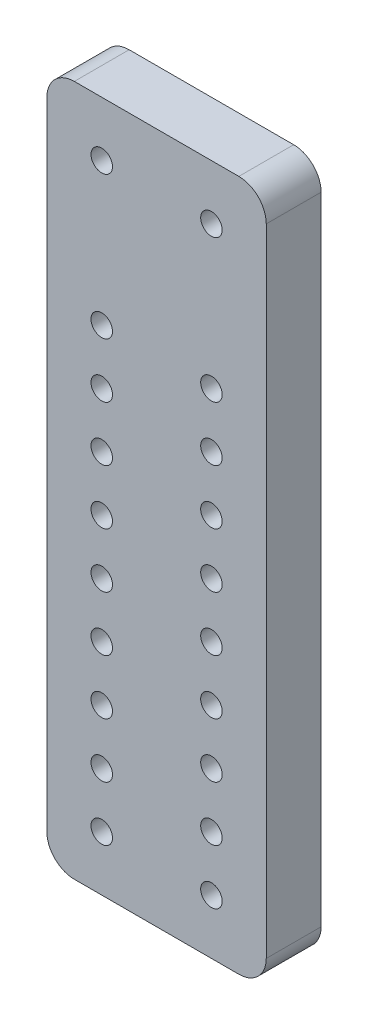
ISO-10303-21;
HEADER;
FILE_DESCRIPTION(('STEP AP214'),'2;1');
FILE_NAME('part.step','',(''),(''),'','','');
FILE_SCHEMA(('AUTOMOTIVE_DESIGN { 1 0 10303 214 1 1 1 1 }'));
ENDSEC;
DATA;
#1=APPLICATION_CONTEXT('core data for automotive mechanical design processes');
#2=APPLICATION_PROTOCOL_DEFINITION('international standard','automotive_design',2000,#1);
#3=PRODUCT_CONTEXT('',#1,'mechanical');
#4=PRODUCT('Part','Part','',(#3));
#5=PRODUCT_RELATED_PRODUCT_CATEGORY('part','',(#4));
#6=PRODUCT_DEFINITION_FORMATION('','',#4);
#7=PRODUCT_DEFINITION_CONTEXT('part definition',#1,'design');
#8=PRODUCT_DEFINITION('design','',#6,#7);
#9=PRODUCT_DEFINITION_SHAPE('','',#8);
#10=(LENGTH_UNIT() NAMED_UNIT(*) SI_UNIT(.MILLI.,.METRE.));
#11=(NAMED_UNIT(*) PLANE_ANGLE_UNIT() SI_UNIT($,.RADIAN.));
#12=(NAMED_UNIT(*) SI_UNIT($,.STERADIAN.) SOLID_ANGLE_UNIT());
#13=UNCERTAINTY_MEASURE_WITH_UNIT(LENGTH_MEASURE(1.E-05),#10,'distance_accuracy_value','');
#14=(GEOMETRIC_REPRESENTATION_CONTEXT(3) GLOBAL_UNCERTAINTY_ASSIGNED_CONTEXT((#13)) GLOBAL_UNIT_ASSIGNED_CONTEXT((#10,
#11,#12)) REPRESENTATION_CONTEXT('',''));
#15=CARTESIAN_POINT('',(0.,0.,0.));
#16=DIRECTION('',(0.,0.,1.));
#17=DIRECTION('',(1.,0.,0.));
#18=AXIS2_PLACEMENT_3D('',#15,#16,#17);
#19=CARTESIAN_POINT('',(0.,0.,-12.7));
#20=DIRECTION('',(-1.,0.,0.));
#21=DIRECTION('',(0.,0.,1.));
#22=AXIS2_PLACEMENT_3D('',#19,#20,#21);
#23=PLANE('',#22);
#24=DIRECTION('',(0.,-1.,0.));
#25=VECTOR('',#24,1.);
#26=CARTESIAN_POINT('',(0.,0.,-12.7));
#27=LINE('',#26,#25);
#28=CARTESIAN_POINT('',(0.,153.67,-12.7));
#29=VERTEX_POINT('',#28);
#30=CARTESIAN_POINT('',(0.,6.35,-12.7));
#31=VERTEX_POINT('',#30);
#32=EDGE_CURVE('E173',#29,#31,#27,.T.);
#33=ORIENTED_EDGE('',*,*,#32,.T.);
#34=DIRECTION('',(0.,0.,1.));
#35=VECTOR('',#34,1.);
#36=CARTESIAN_POINT('',(0.,6.35,-12.7));
#37=LINE('',#36,#35);
#38=CARTESIAN_POINT('',(0.,6.35,0.));
#39=VERTEX_POINT('',#38);
#40=EDGE_CURVE('E120',#31,#39,#37,.T.);
#41=ORIENTED_EDGE('',*,*,#40,.T.);
#42=DIRECTION('',(0.,-1.,0.));
#43=VECTOR('',#42,1.);
#44=CARTESIAN_POINT('',(0.,0.,0.));
#45=LINE('',#44,#43);
#46=CARTESIAN_POINT('',(0.,153.67,0.));
#47=VERTEX_POINT('',#46);
#48=EDGE_CURVE('E112',#47,#39,#45,.T.);
#49=ORIENTED_EDGE('',*,*,#48,.F.);
#50=DIRECTION('',(0.,0.,1.));
#51=VECTOR('',#50,1.);
#52=CARTESIAN_POINT('',(0.,153.67,-12.7));
#53=LINE('',#52,#51);
#54=EDGE_CURVE('E125',#47,#29,#53,.F.);
#55=ORIENTED_EDGE('',*,*,#54,.T.);
#56=EDGE_LOOP('',(#33,#41,#49,#55));
#57=FACE_BOUND('',#56,.T.);
#58=ADVANCED_FACE('F43',(#57),#23,.T.);
#59=CARTESIAN_POINT('',(0.,160.02,-12.7));
#60=DIRECTION('',(0.,1.,0.));
#61=DIRECTION('',(0.,0.,1.));
#62=AXIS2_PLACEMENT_3D('',#59,#60,#61);
#63=PLANE('',#62);
#64=DIRECTION('',(-1.,0.,0.));
#65=VECTOR('',#64,1.);
#66=CARTESIAN_POINT('',(0.,160.02,0.));
#67=LINE('',#66,#65);
#68=CARTESIAN_POINT('',(44.45,160.02,0.));
#69=VERTEX_POINT('',#68);
#70=CARTESIAN_POINT('',(6.35,160.02,0.));
#71=VERTEX_POINT('',#70);
#72=EDGE_CURVE('E114',#69,#71,#67,.T.);
#73=ORIENTED_EDGE('',*,*,#72,.F.);
#74=DIRECTION('',(0.,0.,1.));
#75=VECTOR('',#74,1.);
#76=CARTESIAN_POINT('',(44.45,160.02,-12.7));
#77=LINE('',#76,#75);
#78=CARTESIAN_POINT('',(44.45,160.02,-12.7));
#79=VERTEX_POINT('',#78);
#80=EDGE_CURVE('E11',#69,#79,#77,.F.);
#81=ORIENTED_EDGE('',*,*,#80,.T.);
#82=DIRECTION('',(-1.,0.,0.));
#83=VECTOR('',#82,1.);
#84=CARTESIAN_POINT('',(0.,160.02,-12.7));
#85=LINE('',#84,#83);
#86=CARTESIAN_POINT('',(6.35,160.02,-12.7));
#87=VERTEX_POINT('',#86);
#88=EDGE_CURVE('E133',#79,#87,#85,.T.);
#89=ORIENTED_EDGE('',*,*,#88,.T.);
#90=DIRECTION('',(0.,0.,1.));
#91=VECTOR('',#90,1.);
#92=CARTESIAN_POINT('',(6.35,160.02,-12.7));
#93=LINE('',#92,#91);
#94=EDGE_CURVE('E51',#87,#71,#93,.T.);
#95=ORIENTED_EDGE('',*,*,#94,.T.);
#96=EDGE_LOOP('',(#73,#81,#89,#95));
#97=FACE_BOUND('',#96,.T.);
#98=ADVANCED_FACE('F162',(#97),#63,.T.);
#99=CARTESIAN_POINT('',(50.8,0.,-12.7));
#100=DIRECTION('',(1.,0.,0.));
#101=DIRECTION('',(0.,0.,-1.));
#102=AXIS2_PLACEMENT_3D('',#99,#100,#101);
#103=PLANE('',#102);
#104=DIRECTION('',(0.,1.,0.));
#105=VECTOR('',#104,1.);
#106=CARTESIAN_POINT('',(50.8,0.,0.));
#107=LINE('',#106,#105);
#108=CARTESIAN_POINT('',(50.8,6.35,0.));
#109=VERTEX_POINT('',#108);
#110=CARTESIAN_POINT('',(50.8,153.67,0.));
#111=VERTEX_POINT('',#110);
#112=EDGE_CURVE('E171',#109,#111,#107,.T.);
#113=ORIENTED_EDGE('',*,*,#112,.F.);
#114=DIRECTION('',(0.,0.,1.));
#115=VECTOR('',#114,1.);
#116=CARTESIAN_POINT('',(50.8,6.35,-12.7));
#117=LINE('',#116,#115);
#118=CARTESIAN_POINT('',(50.8,6.35,-12.7));
#119=VERTEX_POINT('',#118);
#120=EDGE_CURVE('E65',#109,#119,#117,.F.);
#121=ORIENTED_EDGE('',*,*,#120,.T.);
#122=DIRECTION('',(0.,1.,0.));
#123=VECTOR('',#122,1.);
#124=CARTESIAN_POINT('',(50.8,0.,-12.7));
#125=LINE('',#124,#123);
#126=CARTESIAN_POINT('',(50.8,153.67,-12.7));
#127=VERTEX_POINT('',#126);
#128=EDGE_CURVE('E137',#119,#127,#125,.T.);
#129=ORIENTED_EDGE('',*,*,#128,.T.);
#130=DIRECTION('',(0.,0.,1.));
#131=VECTOR('',#130,1.);
#132=CARTESIAN_POINT('',(50.8,153.67,-12.7));
#133=LINE('',#132,#131);
#134=EDGE_CURVE('E158',#127,#111,#133,.T.);
#135=ORIENTED_EDGE('',*,*,#134,.T.);
#136=EDGE_LOOP('',(#113,#121,#129,#135));
#137=FACE_BOUND('',#136,.T.);
#138=ADVANCED_FACE('F170',(#137),#103,.T.);
#139=CARTESIAN_POINT('',(0.,0.,-12.7));
#140=DIRECTION('',(0.,-1.,0.));
#141=DIRECTION('',(0.,0.,-1.));
#142=AXIS2_PLACEMENT_3D('',#139,#140,#141);
#143=PLANE('',#142);
#144=DIRECTION('',(1.,0.,0.));
#145=VECTOR('',#144,1.);
#146=CARTESIAN_POINT('',(0.,0.,0.));
#147=LINE('',#146,#145);
#148=CARTESIAN_POINT('',(6.35,0.,0.));
#149=VERTEX_POINT('',#148);
#150=CARTESIAN_POINT('',(44.45,0.,0.));
#151=VERTEX_POINT('',#150);
#152=EDGE_CURVE('E128',#149,#151,#147,.T.);
#153=ORIENTED_EDGE('',*,*,#152,.F.);
#154=DIRECTION('',(0.,0.,1.));
#155=VECTOR('',#154,1.);
#156=CARTESIAN_POINT('',(6.35,0.,-12.7));
#157=LINE('',#156,#155);
#158=CARTESIAN_POINT('',(6.35,0.,-12.7));
#159=VERTEX_POINT('',#158);
#160=EDGE_CURVE('E150',#149,#159,#157,.F.);
#161=ORIENTED_EDGE('',*,*,#160,.T.);
#162=DIRECTION('',(1.,0.,0.));
#163=VECTOR('',#162,1.);
#164=CARTESIAN_POINT('',(0.,0.,-12.7));
#165=LINE('',#164,#163);
#166=CARTESIAN_POINT('',(44.45,0.,-12.7));
#167=VERTEX_POINT('',#166);
#168=EDGE_CURVE('E177',#159,#167,#165,.T.);
#169=ORIENTED_EDGE('',*,*,#168,.T.);
#170=DIRECTION('',(0.,0.,1.));
#171=VECTOR('',#170,1.);
#172=CARTESIAN_POINT('',(44.45,0.,-12.7));
#173=LINE('',#172,#171);
#174=EDGE_CURVE('E147',#167,#151,#173,.T.);
#175=ORIENTED_EDGE('',*,*,#174,.T.);
#176=EDGE_LOOP('',(#153,#161,#169,#175));
#177=FACE_BOUND('',#176,.T.);
#178=ADVANCED_FACE('F336',(#177),#143,.T.);
#179=CARTESIAN_POINT('',(0.,0.,-12.7));
#180=DIRECTION('',(0.,0.,-1.));
#181=DIRECTION('',(-1.,0.,0.));
#182=AXIS2_PLACEMENT_3D('',#179,#180,#181);
#183=PLANE('',#182);
#184=CARTESIAN_POINT('',(38.1,76.2,-12.7));
#185=DIRECTION('',(0.,0.,1.));
#186=DIRECTION('',(1.,0.,0.));
#187=AXIS2_PLACEMENT_3D('',#184,#185,#186);
#188=CIRCLE('',#187,2.4892);
#189=CARTESIAN_POINT('',(40.5892,76.2,-12.7));
#190=VERTEX_POINT('',#189);
#191=EDGE_CURVE('E247',#190,#190,#188,.T.);
#192=ORIENTED_EDGE('',*,*,#191,.T.);
#193=EDGE_LOOP('',(#192));
#194=FACE_BOUND('',#193,.T.);
#195=CARTESIAN_POINT('',(38.1,88.9,-12.7));
#196=DIRECTION('',(0.,0.,1.));
#197=DIRECTION('',(1.,0.,0.));
#198=AXIS2_PLACEMENT_3D('',#195,#196,#197);
#199=CIRCLE('',#198,2.48920000000001);
#200=CARTESIAN_POINT('',(40.5892,88.9,-12.7));
#201=VERTEX_POINT('',#200);
#202=EDGE_CURVE('E254',#201,#201,#199,.T.);
#203=ORIENTED_EDGE('',*,*,#202,.T.);
#204=EDGE_LOOP('',(#203));
#205=FACE_BOUND('',#204,.T.);
#206=CARTESIAN_POINT('',(38.1,101.6,-12.7));
#207=DIRECTION('',(0.,0.,1.));
#208=DIRECTION('',(1.,0.,0.));
#209=AXIS2_PLACEMENT_3D('',#206,#207,#208);
#210=CIRCLE('',#209,2.4892);
#211=CARTESIAN_POINT('',(40.5892,101.6,-12.7));
#212=VERTEX_POINT('',#211);
#213=EDGE_CURVE('E235',#212,#212,#210,.T.);
#214=ORIENTED_EDGE('',*,*,#213,.T.);
#215=EDGE_LOOP('',(#214));
#216=FACE_BOUND('',#215,.T.);
#217=CARTESIAN_POINT('',(12.7,12.7,-12.7));
#218=DIRECTION('',(0.,0.,1.));
#219=DIRECTION('',(1.,0.,0.));
#220=AXIS2_PLACEMENT_3D('',#217,#218,#219);
#221=CIRCLE('',#220,2.4892);
#222=CARTESIAN_POINT('',(15.1892,12.7,-12.7));
#223=VERTEX_POINT('',#222);
#224=EDGE_CURVE('E242',#223,#223,#221,.T.);
#225=ORIENTED_EDGE('',*,*,#224,.T.);
#226=EDGE_LOOP('',(#225));
#227=FACE_BOUND('',#226,.T.);
#228=CARTESIAN_POINT('',(38.1,63.5,-12.7));
#229=DIRECTION('',(0.,0.,1.));
#230=DIRECTION('',(1.,0.,0.));
#231=AXIS2_PLACEMENT_3D('',#228,#229,#230);
#232=CIRCLE('',#231,2.4892);
#233=CARTESIAN_POINT('',(40.5892,63.5,-12.7));
#234=VERTEX_POINT('',#233);
#235=EDGE_CURVE('E278',#234,#234,#232,.T.);
#236=ORIENTED_EDGE('',*,*,#235,.T.);
#237=EDGE_LOOP('',(#236));
#238=FACE_BOUND('',#237,.T.);
#239=CARTESIAN_POINT('',(38.1,50.8,-12.7));
#240=DIRECTION('',(0.,0.,1.));
#241=DIRECTION('',(1.,0.,0.));
#242=AXIS2_PLACEMENT_3D('',#239,#240,#241);
#243=CIRCLE('',#242,2.4892);
#244=CARTESIAN_POINT('',(40.5892,50.8,-12.7));
#245=VERTEX_POINT('',#244);
#246=EDGE_CURVE('E272',#245,#245,#243,.T.);
#247=ORIENTED_EDGE('',*,*,#246,.T.);
#248=EDGE_LOOP('',(#247));
#249=FACE_BOUND('',#248,.T.);
#250=CARTESIAN_POINT('',(38.1,38.1,-12.7));
#251=DIRECTION('',(0.,0.,1.));
#252=DIRECTION('',(1.,0.,0.));
#253=AXIS2_PLACEMENT_3D('',#250,#251,#252);
#254=CIRCLE('',#253,2.4892);
#255=CARTESIAN_POINT('',(40.5892,38.1,-12.7));
#256=VERTEX_POINT('',#255);
#257=EDGE_CURVE('E266',#256,#256,#254,.T.);
#258=ORIENTED_EDGE('',*,*,#257,.T.);
#259=EDGE_LOOP('',(#258));
#260=FACE_BOUND('',#259,.T.);
#261=CARTESIAN_POINT('',(38.1,25.4,-12.7));
#262=DIRECTION('',(0.,0.,1.));
#263=DIRECTION('',(1.,0.,0.));
#264=AXIS2_PLACEMENT_3D('',#261,#262,#263);
#265=CIRCLE('',#264,2.4892);
#266=CARTESIAN_POINT('',(40.5892,25.4,-12.7));
#267=VERTEX_POINT('',#266);
#268=EDGE_CURVE('E259',#267,#267,#265,.T.);
#269=ORIENTED_EDGE('',*,*,#268,.T.);
#270=EDGE_LOOP('',(#269));
#271=FACE_BOUND('',#270,.T.);
#272=CARTESIAN_POINT('',(12.7,25.4,-12.7));
#273=DIRECTION('',(0.,0.,1.));
#274=DIRECTION('',(1.,0.,0.));
#275=AXIS2_PLACEMENT_3D('',#272,#273,#274);
#276=CIRCLE('',#275,2.4892);
#277=CARTESIAN_POINT('',(15.1892,25.4,-12.7));
#278=VERTEX_POINT('',#277);
#279=EDGE_CURVE('E187',#278,#278,#276,.T.);
#280=ORIENTED_EDGE('',*,*,#279,.T.);
#281=EDGE_LOOP('',(#280));
#282=FACE_BOUND('',#281,.T.);
#283=CARTESIAN_POINT('',(12.7,38.1,-12.7));
#284=DIRECTION('',(0.,0.,1.));
#285=DIRECTION('',(1.,0.,0.));
#286=AXIS2_PLACEMENT_3D('',#283,#284,#285);
#287=CIRCLE('',#286,2.4892);
#288=CARTESIAN_POINT('',(15.1892,38.1,-12.7));
#289=VERTEX_POINT('',#288);
#290=EDGE_CURVE('E194',#289,#289,#287,.T.);
#291=ORIENTED_EDGE('',*,*,#290,.T.);
#292=EDGE_LOOP('',(#291));
#293=FACE_BOUND('',#292,.T.);
#294=CARTESIAN_POINT('',(12.7,50.8,-12.7));
#295=DIRECTION('',(0.,0.,1.));
#296=DIRECTION('',(1.,0.,0.));
#297=AXIS2_PLACEMENT_3D('',#294,#295,#296);
#298=CIRCLE('',#297,2.4892);
#299=CARTESIAN_POINT('',(15.1892,50.8,-12.7));
#300=VERTEX_POINT('',#299);
#301=EDGE_CURVE('E200',#300,#300,#298,.T.);
#302=ORIENTED_EDGE('',*,*,#301,.T.);
#303=EDGE_LOOP('',(#302));
#304=FACE_BOUND('',#303,.T.);
#305=CARTESIAN_POINT('',(12.7,63.5,-12.7));
#306=DIRECTION('',(0.,0.,1.));
#307=DIRECTION('',(1.,0.,0.));
#308=AXIS2_PLACEMENT_3D('',#305,#306,#307);
#309=CIRCLE('',#308,2.4892);
#310=CARTESIAN_POINT('',(15.1892,63.5,-12.7));
#311=VERTEX_POINT('',#310);
#312=EDGE_CURVE('E206',#311,#311,#309,.T.);
#313=ORIENTED_EDGE('',*,*,#312,.T.);
#314=EDGE_LOOP('',(#313));
#315=FACE_BOUND('',#314,.T.);
#316=CARTESIAN_POINT('',(12.7,76.2,-12.7));
#317=DIRECTION('',(0.,0.,1.));
#318=DIRECTION('',(1.,0.,0.));
#319=AXIS2_PLACEMENT_3D('',#316,#317,#318);
#320=CIRCLE('',#319,2.4892);
#321=CARTESIAN_POINT('',(15.1892,76.2,-12.7));
#322=VERTEX_POINT('',#321);
#323=EDGE_CURVE('E212',#322,#322,#320,.T.);
#324=ORIENTED_EDGE('',*,*,#323,.T.);
#325=EDGE_LOOP('',(#324));
#326=FACE_BOUND('',#325,.T.);
#327=CARTESIAN_POINT('',(12.7,88.9,-12.7));
#328=DIRECTION('',(0.,0.,1.));
#329=DIRECTION('',(1.,0.,0.));
#330=AXIS2_PLACEMENT_3D('',#327,#328,#329);
#331=CIRCLE('',#330,2.4892);
#332=CARTESIAN_POINT('',(15.1892,88.9,-12.7));
#333=VERTEX_POINT('',#332);
#334=EDGE_CURVE('E218',#333,#333,#331,.T.);
#335=ORIENTED_EDGE('',*,*,#334,.T.);
#336=EDGE_LOOP('',(#335));
#337=FACE_BOUND('',#336,.T.);
#338=CARTESIAN_POINT('',(12.7,101.6,-12.7));
#339=DIRECTION('',(0.,0.,1.));
#340=DIRECTION('',(1.,0.,0.));
#341=AXIS2_PLACEMENT_3D('',#338,#339,#340);
#342=CIRCLE('',#341,2.4892);
#343=CARTESIAN_POINT('',(15.1892,101.6,-12.7));
#344=VERTEX_POINT('',#343);
#345=EDGE_CURVE('E224',#344,#344,#342,.T.);
#346=ORIENTED_EDGE('',*,*,#345,.T.);
#347=EDGE_LOOP('',(#346));
#348=FACE_BOUND('',#347,.T.);
#349=CARTESIAN_POINT('',(12.7,114.3,-12.7));
#350=DIRECTION('',(0.,0.,1.));
#351=DIRECTION('',(1.,0.,0.));
#352=AXIS2_PLACEMENT_3D('',#349,#350,#351);
#353=CIRCLE('',#352,2.4892);
#354=CARTESIAN_POINT('',(15.1892,114.3,-12.7));
#355=VERTEX_POINT('',#354);
#356=EDGE_CURVE('E230',#355,#355,#353,.T.);
#357=ORIENTED_EDGE('',*,*,#356,.T.);
#358=EDGE_LOOP('',(#357));
#359=FACE_BOUND('',#358,.T.);
#360=CARTESIAN_POINT('',(38.1,114.3,-12.7));
#361=DIRECTION('',(0.,0.,1.));
#362=DIRECTION('',(1.,0.,0.));
#363=AXIS2_PLACEMENT_3D('',#360,#361,#362);
#364=CIRCLE('',#363,2.4892);
#365=CARTESIAN_POINT('',(40.5892,114.3,-12.7));
#366=VERTEX_POINT('',#365);
#367=EDGE_CURVE('E295',#366,#366,#364,.T.);
#368=ORIENTED_EDGE('',*,*,#367,.T.);
#369=EDGE_LOOP('',(#368));
#370=FACE_BOUND('',#369,.T.);
#371=CARTESIAN_POINT('',(38.1,12.7,-12.7));
#372=DIRECTION('',(0.,0.,1.));
#373=DIRECTION('',(1.,0.,0.));
#374=AXIS2_PLACEMENT_3D('',#371,#372,#373);
#375=CIRCLE('',#374,2.4892);
#376=CARTESIAN_POINT('',(40.5892,12.7,-12.7));
#377=VERTEX_POINT('',#376);
#378=EDGE_CURVE('E283',#377,#377,#375,.T.);
#379=ORIENTED_EDGE('',*,*,#378,.T.);
#380=EDGE_LOOP('',(#379));
#381=FACE_BOUND('',#380,.T.);
#382=CARTESIAN_POINT('',(38.1,147.32,-12.7));
#383=DIRECTION('',(0.,0.,1.));
#384=DIRECTION('',(1.,0.,0.));
#385=AXIS2_PLACEMENT_3D('',#382,#383,#384);
#386=CIRCLE('',#385,2.48920000000001);
#387=CARTESIAN_POINT('',(40.5892,147.32,-12.7));
#388=VERTEX_POINT('',#387);
#389=EDGE_CURVE('E290',#388,#388,#386,.T.);
#390=ORIENTED_EDGE('',*,*,#389,.T.);
#391=EDGE_LOOP('',(#390));
#392=FACE_BOUND('',#391,.T.);
#393=CARTESIAN_POINT('',(12.7,147.32,-12.7));
#394=DIRECTION('',(0.,0.,1.));
#395=DIRECTION('',(1.,0.,0.));
#396=AXIS2_PLACEMENT_3D('',#393,#394,#395);
#397=CIRCLE('',#396,2.4892);
#398=CARTESIAN_POINT('',(15.1892,147.32,-12.7));
#399=VERTEX_POINT('',#398);
#400=EDGE_CURVE('E129',#399,#399,#397,.T.);
#401=ORIENTED_EDGE('',*,*,#400,.T.);
#402=EDGE_LOOP('',(#401));
#403=FACE_BOUND('',#402,.T.);
#404=ORIENTED_EDGE('',*,*,#168,.F.);
#405=CARTESIAN_POINT('',(6.35,6.35,-12.7));
#406=DIRECTION('',(0.,0.,-1.));
#407=DIRECTION('',(-1.,0.,0.));
#408=AXIS2_PLACEMENT_3D('',#405,#406,#407);
#409=CIRCLE('',#408,6.35);
#410=EDGE_CURVE('E156',#159,#31,#409,.T.);
#411=ORIENTED_EDGE('',*,*,#410,.T.);
#412=ORIENTED_EDGE('',*,*,#32,.F.);
#413=CARTESIAN_POINT('',(6.35,153.67,-12.7));
#414=DIRECTION('',(0.,0.,-1.));
#415=DIRECTION('',(-1.,0.,0.));
#416=AXIS2_PLACEMENT_3D('',#413,#414,#415);
#417=CIRCLE('',#416,6.35);
#418=EDGE_CURVE('E132',#29,#87,#417,.T.);
#419=ORIENTED_EDGE('',*,*,#418,.T.);
#420=ORIENTED_EDGE('',*,*,#88,.F.);
#421=CARTESIAN_POINT('',(44.45,153.67,-12.7));
#422=DIRECTION('',(0.,0.,-1.));
#423=DIRECTION('',(-1.,0.,0.));
#424=AXIS2_PLACEMENT_3D('',#421,#422,#423);
#425=CIRCLE('',#424,6.35);
#426=EDGE_CURVE('E58',#79,#127,#425,.T.);
#427=ORIENTED_EDGE('',*,*,#426,.T.);
#428=ORIENTED_EDGE('',*,*,#128,.F.);
#429=CARTESIAN_POINT('',(44.45,6.35,-12.7));
#430=DIRECTION('',(0.,0.,-1.));
#431=DIRECTION('',(-1.,0.,0.));
#432=AXIS2_PLACEMENT_3D('',#429,#430,#431);
#433=CIRCLE('',#432,6.35);
#434=EDGE_CURVE('E154',#119,#167,#433,.T.);
#435=ORIENTED_EDGE('',*,*,#434,.T.);
#436=EDGE_LOOP('',(#404,#411,#412,#419,#420,#427,#428,#435));
#437=FACE_BOUND('',#436,.T.);
#438=ADVANCED_FACE('F165',(#194,#205,#216,#227,#238,#249,#260,#271,#282,#293,#304,#315,#326,
#337,#348,#359,#370,#381,#392,#403,#437),#183,.T.);
#439=CARTESIAN_POINT('',(0.,0.,0.));
#440=DIRECTION('',(0.,0.,-1.));
#441=DIRECTION('',(-1.,0.,0.));
#442=AXIS2_PLACEMENT_3D('',#439,#440,#441);
#443=PLANE('',#442);
#444=CARTESIAN_POINT('',(38.1,76.2,0.));
#445=DIRECTION('',(0.,0.,1.));
#446=DIRECTION('',(1.,0.,0.));
#447=AXIS2_PLACEMENT_3D('',#444,#445,#446);
#448=CIRCLE('',#447,2.4892);
#449=CARTESIAN_POINT('',(40.5892,76.2,0.));
#450=VERTEX_POINT('',#449);
#451=EDGE_CURVE('E250',#450,#450,#448,.T.);
#452=ORIENTED_EDGE('',*,*,#451,.F.);
#453=EDGE_LOOP('',(#452));
#454=FACE_BOUND('',#453,.T.);
#455=CARTESIAN_POINT('',(38.1,88.9,0.));
#456=DIRECTION('',(0.,0.,1.));
#457=DIRECTION('',(1.,0.,0.));
#458=AXIS2_PLACEMENT_3D('',#455,#456,#457);
#459=CIRCLE('',#458,2.48920000000001);
#460=CARTESIAN_POINT('',(40.5892,88.9,0.));
#461=VERTEX_POINT('',#460);
#462=EDGE_CURVE('E239',#461,#461,#459,.T.);
#463=ORIENTED_EDGE('',*,*,#462,.F.);
#464=EDGE_LOOP('',(#463));
#465=FACE_BOUND('',#464,.T.);
#466=CARTESIAN_POINT('',(38.1,101.6,0.));
#467=DIRECTION('',(0.,0.,1.));
#468=DIRECTION('',(1.,0.,0.));
#469=AXIS2_PLACEMENT_3D('',#466,#467,#468);
#470=CIRCLE('',#469,2.4892);
#471=CARTESIAN_POINT('',(40.5892,101.6,0.));
#472=VERTEX_POINT('',#471);
#473=EDGE_CURVE('E238',#472,#472,#470,.T.);
#474=ORIENTED_EDGE('',*,*,#473,.F.);
#475=EDGE_LOOP('',(#474));
#476=FACE_BOUND('',#475,.T.);
#477=CARTESIAN_POINT('',(12.7,12.7,0.));
#478=DIRECTION('',(0.,0.,1.));
#479=DIRECTION('',(1.,0.,0.));
#480=AXIS2_PLACEMENT_3D('',#477,#478,#479);
#481=CIRCLE('',#480,2.4892);
#482=CARTESIAN_POINT('',(15.1892,12.7,0.));
#483=VERTEX_POINT('',#482);
#484=EDGE_CURVE('E191',#483,#483,#481,.T.);
#485=ORIENTED_EDGE('',*,*,#484,.F.);
#486=EDGE_LOOP('',(#485));
#487=FACE_BOUND('',#486,.T.);
#488=CARTESIAN_POINT('',(38.1,63.5,0.));
#489=DIRECTION('',(0.,0.,1.));
#490=DIRECTION('',(1.,0.,0.));
#491=AXIS2_PLACEMENT_3D('',#488,#489,#490);
#492=CIRCLE('',#491,2.4892);
#493=CARTESIAN_POINT('',(40.5892,63.5,0.));
#494=VERTEX_POINT('',#493);
#495=EDGE_CURVE('E251',#494,#494,#492,.T.);
#496=ORIENTED_EDGE('',*,*,#495,.F.);
#497=EDGE_LOOP('',(#496));
#498=FACE_BOUND('',#497,.T.);
#499=CARTESIAN_POINT('',(38.1,50.8,0.));
#500=DIRECTION('',(0.,0.,1.));
#501=DIRECTION('',(1.,0.,0.));
#502=AXIS2_PLACEMENT_3D('',#499,#500,#501);
#503=CIRCLE('',#502,2.4892);
#504=CARTESIAN_POINT('',(40.5892,50.8,0.));
#505=VERTEX_POINT('',#504);
#506=EDGE_CURVE('E275',#505,#505,#503,.T.);
#507=ORIENTED_EDGE('',*,*,#506,.F.);
#508=EDGE_LOOP('',(#507));
#509=FACE_BOUND('',#508,.T.);
#510=CARTESIAN_POINT('',(38.1,38.1,0.));
#511=DIRECTION('',(0.,0.,1.));
#512=DIRECTION('',(1.,0.,0.));
#513=AXIS2_PLACEMENT_3D('',#510,#511,#512);
#514=CIRCLE('',#513,2.4892);
#515=CARTESIAN_POINT('',(40.5892,38.1,0.));
#516=VERTEX_POINT('',#515);
#517=EDGE_CURVE('E269',#516,#516,#514,.T.);
#518=ORIENTED_EDGE('',*,*,#517,.F.);
#519=EDGE_LOOP('',(#518));
#520=FACE_BOUND('',#519,.T.);
#521=CARTESIAN_POINT('',(38.1,25.4,0.));
#522=DIRECTION('',(0.,0.,1.));
#523=DIRECTION('',(1.,0.,0.));
#524=AXIS2_PLACEMENT_3D('',#521,#522,#523);
#525=CIRCLE('',#524,2.4892);
#526=CARTESIAN_POINT('',(40.5892,25.4,0.));
#527=VERTEX_POINT('',#526);
#528=EDGE_CURVE('E262',#527,#527,#525,.T.);
#529=ORIENTED_EDGE('',*,*,#528,.F.);
#530=EDGE_LOOP('',(#529));
#531=FACE_BOUND('',#530,.T.);
#532=CARTESIAN_POINT('',(12.7,25.4,0.));
#533=DIRECTION('',(0.,0.,1.));
#534=DIRECTION('',(1.,0.,0.));
#535=AXIS2_PLACEMENT_3D('',#532,#533,#534);
#536=CIRCLE('',#535,2.4892);
#537=CARTESIAN_POINT('',(15.1892,25.4,0.));
#538=VERTEX_POINT('',#537);
#539=EDGE_CURVE('E190',#538,#538,#536,.T.);
#540=ORIENTED_EDGE('',*,*,#539,.F.);
#541=EDGE_LOOP('',(#540));
#542=FACE_BOUND('',#541,.T.);
#543=CARTESIAN_POINT('',(12.7,38.1,0.));
#544=DIRECTION('',(0.,0.,1.));
#545=DIRECTION('',(1.,0.,0.));
#546=AXIS2_PLACEMENT_3D('',#543,#544,#545);
#547=CIRCLE('',#546,2.4892);
#548=CARTESIAN_POINT('',(15.1892,38.1,0.));
#549=VERTEX_POINT('',#548);
#550=EDGE_CURVE('E197',#549,#549,#547,.T.);
#551=ORIENTED_EDGE('',*,*,#550,.F.);
#552=EDGE_LOOP('',(#551));
#553=FACE_BOUND('',#552,.T.);
#554=CARTESIAN_POINT('',(12.7,50.8,0.));
#555=DIRECTION('',(0.,0.,1.));
#556=DIRECTION('',(1.,0.,0.));
#557=AXIS2_PLACEMENT_3D('',#554,#555,#556);
#558=CIRCLE('',#557,2.4892);
#559=CARTESIAN_POINT('',(15.1892,50.8,0.));
#560=VERTEX_POINT('',#559);
#561=EDGE_CURVE('E203',#560,#560,#558,.T.);
#562=ORIENTED_EDGE('',*,*,#561,.F.);
#563=EDGE_LOOP('',(#562));
#564=FACE_BOUND('',#563,.T.);
#565=CARTESIAN_POINT('',(12.7,63.5,0.));
#566=DIRECTION('',(0.,0.,1.));
#567=DIRECTION('',(1.,0.,0.));
#568=AXIS2_PLACEMENT_3D('',#565,#566,#567);
#569=CIRCLE('',#568,2.4892);
#570=CARTESIAN_POINT('',(15.1892,63.5,0.));
#571=VERTEX_POINT('',#570);
#572=EDGE_CURVE('E209',#571,#571,#569,.T.);
#573=ORIENTED_EDGE('',*,*,#572,.F.);
#574=EDGE_LOOP('',(#573));
#575=FACE_BOUND('',#574,.T.);
#576=CARTESIAN_POINT('',(12.7,76.2,0.));
#577=DIRECTION('',(0.,0.,1.));
#578=DIRECTION('',(1.,0.,0.));
#579=AXIS2_PLACEMENT_3D('',#576,#577,#578);
#580=CIRCLE('',#579,2.4892);
#581=CARTESIAN_POINT('',(15.1892,76.2,0.));
#582=VERTEX_POINT('',#581);
#583=EDGE_CURVE('E215',#582,#582,#580,.T.);
#584=ORIENTED_EDGE('',*,*,#583,.F.);
#585=EDGE_LOOP('',(#584));
#586=FACE_BOUND('',#585,.T.);
#587=CARTESIAN_POINT('',(12.7,88.9,0.));
#588=DIRECTION('',(0.,0.,1.));
#589=DIRECTION('',(1.,0.,0.));
#590=AXIS2_PLACEMENT_3D('',#587,#588,#589);
#591=CIRCLE('',#590,2.4892);
#592=CARTESIAN_POINT('',(15.1892,88.9,0.));
#593=VERTEX_POINT('',#592);
#594=EDGE_CURVE('E221',#593,#593,#591,.T.);
#595=ORIENTED_EDGE('',*,*,#594,.F.);
#596=EDGE_LOOP('',(#595));
#597=FACE_BOUND('',#596,.T.);
#598=CARTESIAN_POINT('',(12.7,101.6,0.));
#599=DIRECTION('',(0.,0.,1.));
#600=DIRECTION('',(1.,0.,0.));
#601=AXIS2_PLACEMENT_3D('',#598,#599,#600);
#602=CIRCLE('',#601,2.4892);
#603=CARTESIAN_POINT('',(15.1892,101.6,0.));
#604=VERTEX_POINT('',#603);
#605=EDGE_CURVE('E227',#604,#604,#602,.T.);
#606=ORIENTED_EDGE('',*,*,#605,.F.);
#607=EDGE_LOOP('',(#606));
#608=FACE_BOUND('',#607,.T.);
#609=CARTESIAN_POINT('',(12.7,114.3,0.));
#610=DIRECTION('',(0.,0.,1.));
#611=DIRECTION('',(1.,0.,0.));
#612=AXIS2_PLACEMENT_3D('',#609,#610,#611);
#613=CIRCLE('',#612,2.4892);
#614=CARTESIAN_POINT('',(15.1892,114.3,0.));
#615=VERTEX_POINT('',#614);
#616=EDGE_CURVE('E184',#615,#615,#613,.T.);
#617=ORIENTED_EDGE('',*,*,#616,.F.);
#618=EDGE_LOOP('',(#617));
#619=FACE_BOUND('',#618,.T.);
#620=CARTESIAN_POINT('',(38.1,114.3,0.));
#621=DIRECTION('',(0.,0.,1.));
#622=DIRECTION('',(1.,0.,0.));
#623=AXIS2_PLACEMENT_3D('',#620,#621,#622);
#624=CIRCLE('',#623,2.4892);
#625=CARTESIAN_POINT('',(40.5892,114.3,0.));
#626=VERTEX_POINT('',#625);
#627=EDGE_CURVE('E287',#626,#626,#624,.T.);
#628=ORIENTED_EDGE('',*,*,#627,.F.);
#629=EDGE_LOOP('',(#628));
#630=FACE_BOUND('',#629,.T.);
#631=CARTESIAN_POINT('',(38.1,12.7,0.));
#632=DIRECTION('',(0.,0.,1.));
#633=DIRECTION('',(1.,0.,0.));
#634=AXIS2_PLACEMENT_3D('',#631,#632,#633);
#635=CIRCLE('',#634,2.4892);
#636=CARTESIAN_POINT('',(40.5892,12.7,0.));
#637=VERTEX_POINT('',#636);
#638=EDGE_CURVE('E286',#637,#637,#635,.T.);
#639=ORIENTED_EDGE('',*,*,#638,.F.);
#640=EDGE_LOOP('',(#639));
#641=FACE_BOUND('',#640,.T.);
#642=CARTESIAN_POINT('',(38.1,147.32,0.));
#643=DIRECTION('',(0.,0.,1.));
#644=DIRECTION('',(1.,0.,0.));
#645=AXIS2_PLACEMENT_3D('',#642,#643,#644);
#646=CIRCLE('',#645,2.48920000000001);
#647=CARTESIAN_POINT('',(40.5892,147.32,0.));
#648=VERTEX_POINT('',#647);
#649=EDGE_CURVE('E263',#648,#648,#646,.T.);
#650=ORIENTED_EDGE('',*,*,#649,.F.);
#651=EDGE_LOOP('',(#650));
#652=FACE_BOUND('',#651,.T.);
#653=CARTESIAN_POINT('',(12.7,147.32,0.));
#654=DIRECTION('',(0.,0.,1.));
#655=DIRECTION('',(1.,0.,0.));
#656=AXIS2_PLACEMENT_3D('',#653,#654,#655);
#657=CIRCLE('',#656,2.4892);
#658=CARTESIAN_POINT('',(15.1892,147.32,0.));
#659=VERTEX_POINT('',#658);
#660=EDGE_CURVE('E181',#659,#659,#657,.T.);
#661=ORIENTED_EDGE('',*,*,#660,.F.);
#662=EDGE_LOOP('',(#661));
#663=FACE_BOUND('',#662,.T.);
#664=ORIENTED_EDGE('',*,*,#48,.T.);
#665=CARTESIAN_POINT('',(6.35,6.35,0.));
#666=DIRECTION('',(0.,0.,-1.));
#667=DIRECTION('',(-1.,0.,0.));
#668=AXIS2_PLACEMENT_3D('',#665,#666,#667);
#669=CIRCLE('',#668,6.35);
#670=EDGE_CURVE('E145',#39,#149,#669,.F.);
#671=ORIENTED_EDGE('',*,*,#670,.T.);
#672=ORIENTED_EDGE('',*,*,#152,.T.);
#673=CARTESIAN_POINT('',(44.45,6.35,0.));
#674=DIRECTION('',(0.,0.,-1.));
#675=DIRECTION('',(-1.,0.,0.));
#676=AXIS2_PLACEMENT_3D('',#673,#674,#675);
#677=CIRCLE('',#676,6.35);
#678=EDGE_CURVE('E143',#151,#109,#677,.F.);
#679=ORIENTED_EDGE('',*,*,#678,.T.);
#680=ORIENTED_EDGE('',*,*,#112,.T.);
#681=CARTESIAN_POINT('',(44.45,153.67,0.));
#682=DIRECTION('',(0.,0.,-1.));
#683=DIRECTION('',(-1.,0.,0.));
#684=AXIS2_PLACEMENT_3D('',#681,#682,#683);
#685=CIRCLE('',#684,6.35);
#686=EDGE_CURVE('E119',#111,#69,#685,.F.);
#687=ORIENTED_EDGE('',*,*,#686,.T.);
#688=ORIENTED_EDGE('',*,*,#72,.T.);
#689=CARTESIAN_POINT('',(6.35,153.67,0.));
#690=DIRECTION('',(0.,0.,-1.));
#691=DIRECTION('',(-1.,0.,0.));
#692=AXIS2_PLACEMENT_3D('',#689,#690,#691);
#693=CIRCLE('',#692,6.35);
#694=EDGE_CURVE('E109',#71,#47,#693,.F.);
#695=ORIENTED_EDGE('',*,*,#694,.T.);
#696=EDGE_LOOP('',(#664,#671,#672,#679,#680,#687,#688,#695));
#697=FACE_BOUND('',#696,.T.);
#698=ADVANCED_FACE('F111',(#454,#465,#476,#487,#498,#509,#520,#531,#542,#553,#564,#575,#586,
#597,#608,#619,#630,#641,#652,#663,#697),#443,.F.);
#699=CARTESIAN_POINT('',(12.7,147.32,-12.7));
#700=DIRECTION('',(0.,0.,1.));
#701=DIRECTION('',(1.,0.,0.));
#702=AXIS2_PLACEMENT_3D('',#699,#700,#701);
#703=CYLINDRICAL_SURFACE('',#702,2.4892);
#704=ORIENTED_EDGE('',*,*,#400,.F.);
#705=EDGE_LOOP('',(#704));
#706=FACE_BOUND('',#705,.T.);
#707=ORIENTED_EDGE('',*,*,#660,.T.);
#708=EDGE_LOOP('',(#707));
#709=FACE_BOUND('',#708,.T.);
#710=ADVANCED_FACE('F305',(#706,#709),#703,.F.);
#711=CARTESIAN_POINT('',(38.1,147.32,-12.7));
#712=DIRECTION('',(0.,0.,1.));
#713=DIRECTION('',(1.,0.,0.));
#714=AXIS2_PLACEMENT_3D('',#711,#712,#713);
#715=CYLINDRICAL_SURFACE('',#714,2.48920000000001);
#716=ORIENTED_EDGE('',*,*,#389,.F.);
#717=EDGE_LOOP('',(#716));
#718=FACE_BOUND('',#717,.T.);
#719=ORIENTED_EDGE('',*,*,#649,.T.);
#720=EDGE_LOOP('',(#719));
#721=FACE_BOUND('',#720,.T.);
#722=ADVANCED_FACE('F315',(#718,#721),#715,.F.);
#723=CARTESIAN_POINT('',(38.1,12.7,-12.7));
#724=DIRECTION('',(0.,0.,1.));
#725=DIRECTION('',(1.,0.,0.));
#726=AXIS2_PLACEMENT_3D('',#723,#724,#725);
#727=CYLINDRICAL_SURFACE('',#726,2.4892);
#728=ORIENTED_EDGE('',*,*,#378,.F.);
#729=EDGE_LOOP('',(#728));
#730=FACE_BOUND('',#729,.T.);
#731=ORIENTED_EDGE('',*,*,#638,.T.);
#732=EDGE_LOOP('',(#731));
#733=FACE_BOUND('',#732,.T.);
#734=ADVANCED_FACE('F321',(#730,#733),#727,.F.);
#735=CARTESIAN_POINT('',(38.1,114.3,-12.7));
#736=DIRECTION('',(0.,0.,1.));
#737=DIRECTION('',(1.,0.,0.));
#738=AXIS2_PLACEMENT_3D('',#735,#736,#737);
#739=CYLINDRICAL_SURFACE('',#738,2.4892);
#740=ORIENTED_EDGE('',*,*,#367,.F.);
#741=EDGE_LOOP('',(#740));
#742=FACE_BOUND('',#741,.T.);
#743=ORIENTED_EDGE('',*,*,#627,.T.);
#744=EDGE_LOOP('',(#743));
#745=FACE_BOUND('',#744,.T.);
#746=ADVANCED_FACE('F301',(#742,#745),#739,.F.);
#747=CARTESIAN_POINT('',(12.7,114.3,-12.7));
#748=DIRECTION('',(0.,0.,1.));
#749=DIRECTION('',(1.,0.,0.));
#750=AXIS2_PLACEMENT_3D('',#747,#748,#749);
#751=CYLINDRICAL_SURFACE('',#750,2.4892);
#752=ORIENTED_EDGE('',*,*,#356,.F.);
#753=EDGE_LOOP('',(#752));
#754=FACE_BOUND('',#753,.T.);
#755=ORIENTED_EDGE('',*,*,#616,.T.);
#756=EDGE_LOOP('',(#755));
#757=FACE_BOUND('',#756,.T.);
#758=ADVANCED_FACE('F516',(#754,#757),#751,.F.);
#759=CARTESIAN_POINT('',(12.7,101.6,-12.7));
#760=DIRECTION('',(0.,0.,1.));
#761=DIRECTION('',(1.,0.,0.));
#762=AXIS2_PLACEMENT_3D('',#759,#760,#761);
#763=CYLINDRICAL_SURFACE('',#762,2.4892);
#764=ORIENTED_EDGE('',*,*,#345,.F.);
#765=EDGE_LOOP('',(#764));
#766=FACE_BOUND('',#765,.T.);
#767=ORIENTED_EDGE('',*,*,#605,.T.);
#768=EDGE_LOOP('',(#767));
#769=FACE_BOUND('',#768,.T.);
#770=ADVANCED_FACE('F506',(#766,#769),#763,.F.);
#771=CARTESIAN_POINT('',(12.7,88.9,-12.7));
#772=DIRECTION('',(0.,0.,1.));
#773=DIRECTION('',(1.,0.,0.));
#774=AXIS2_PLACEMENT_3D('',#771,#772,#773);
#775=CYLINDRICAL_SURFACE('',#774,2.4892);
#776=ORIENTED_EDGE('',*,*,#334,.F.);
#777=EDGE_LOOP('',(#776));
#778=FACE_BOUND('',#777,.T.);
#779=ORIENTED_EDGE('',*,*,#594,.T.);
#780=EDGE_LOOP('',(#779));
#781=FACE_BOUND('',#780,.T.);
#782=ADVANCED_FACE('F496',(#778,#781),#775,.F.);
#783=CARTESIAN_POINT('',(12.7,76.2,-12.7));
#784=DIRECTION('',(0.,0.,1.));
#785=DIRECTION('',(1.,0.,0.));
#786=AXIS2_PLACEMENT_3D('',#783,#784,#785);
#787=CYLINDRICAL_SURFACE('',#786,2.4892);
#788=ORIENTED_EDGE('',*,*,#323,.F.);
#789=EDGE_LOOP('',(#788));
#790=FACE_BOUND('',#789,.T.);
#791=ORIENTED_EDGE('',*,*,#583,.T.);
#792=EDGE_LOOP('',(#791));
#793=FACE_BOUND('',#792,.T.);
#794=ADVANCED_FACE('F486',(#790,#793),#787,.F.);
#795=CARTESIAN_POINT('',(12.7,63.5,-12.7));
#796=DIRECTION('',(0.,0.,1.));
#797=DIRECTION('',(1.,0.,0.));
#798=AXIS2_PLACEMENT_3D('',#795,#796,#797);
#799=CYLINDRICAL_SURFACE('',#798,2.4892);
#800=ORIENTED_EDGE('',*,*,#312,.F.);
#801=EDGE_LOOP('',(#800));
#802=FACE_BOUND('',#801,.T.);
#803=ORIENTED_EDGE('',*,*,#572,.T.);
#804=EDGE_LOOP('',(#803));
#805=FACE_BOUND('',#804,.T.);
#806=ADVANCED_FACE('F476',(#802,#805),#799,.F.);
#807=CARTESIAN_POINT('',(12.7,50.8,-12.7));
#808=DIRECTION('',(0.,0.,1.));
#809=DIRECTION('',(1.,0.,0.));
#810=AXIS2_PLACEMENT_3D('',#807,#808,#809);
#811=CYLINDRICAL_SURFACE('',#810,2.4892);
#812=ORIENTED_EDGE('',*,*,#301,.F.);
#813=EDGE_LOOP('',(#812));
#814=FACE_BOUND('',#813,.T.);
#815=ORIENTED_EDGE('',*,*,#561,.T.);
#816=EDGE_LOOP('',(#815));
#817=FACE_BOUND('',#816,.T.);
#818=ADVANCED_FACE('F466',(#814,#817),#811,.F.);
#819=CARTESIAN_POINT('',(12.7,38.1,-12.7));
#820=DIRECTION('',(0.,0.,1.));
#821=DIRECTION('',(1.,0.,0.));
#822=AXIS2_PLACEMENT_3D('',#819,#820,#821);
#823=CYLINDRICAL_SURFACE('',#822,2.4892);
#824=ORIENTED_EDGE('',*,*,#290,.F.);
#825=EDGE_LOOP('',(#824));
#826=FACE_BOUND('',#825,.T.);
#827=ORIENTED_EDGE('',*,*,#550,.T.);
#828=EDGE_LOOP('',(#827));
#829=FACE_BOUND('',#828,.T.);
#830=ADVANCED_FACE('F457',(#826,#829),#823,.F.);
#831=CARTESIAN_POINT('',(12.7,25.4,-12.7));
#832=DIRECTION('',(0.,0.,1.));
#833=DIRECTION('',(1.,0.,0.));
#834=AXIS2_PLACEMENT_3D('',#831,#832,#833);
#835=CYLINDRICAL_SURFACE('',#834,2.4892);
#836=ORIENTED_EDGE('',*,*,#279,.F.);
#837=EDGE_LOOP('',(#836));
#838=FACE_BOUND('',#837,.T.);
#839=ORIENTED_EDGE('',*,*,#539,.T.);
#840=EDGE_LOOP('',(#839));
#841=FACE_BOUND('',#840,.T.);
#842=ADVANCED_FACE('F447',(#838,#841),#835,.F.);
#843=CARTESIAN_POINT('',(38.1,25.4,-12.7));
#844=DIRECTION('',(0.,0.,1.));
#845=DIRECTION('',(1.,0.,0.));
#846=AXIS2_PLACEMENT_3D('',#843,#844,#845);
#847=CYLINDRICAL_SURFACE('',#846,2.4892);
#848=ORIENTED_EDGE('',*,*,#268,.F.);
#849=EDGE_LOOP('',(#848));
#850=FACE_BOUND('',#849,.T.);
#851=ORIENTED_EDGE('',*,*,#528,.T.);
#852=EDGE_LOOP('',(#851));
#853=FACE_BOUND('',#852,.T.);
#854=ADVANCED_FACE('F437',(#850,#853),#847,.F.);
#855=CARTESIAN_POINT('',(38.1,38.1,-12.7));
#856=DIRECTION('',(0.,0.,1.));
#857=DIRECTION('',(1.,0.,0.));
#858=AXIS2_PLACEMENT_3D('',#855,#856,#857);
#859=CYLINDRICAL_SURFACE('',#858,2.4892);
#860=ORIENTED_EDGE('',*,*,#257,.F.);
#861=EDGE_LOOP('',(#860));
#862=FACE_BOUND('',#861,.T.);
#863=ORIENTED_EDGE('',*,*,#517,.T.);
#864=EDGE_LOOP('',(#863));
#865=FACE_BOUND('',#864,.T.);
#866=ADVANCED_FACE('F427',(#862,#865),#859,.F.);
#867=CARTESIAN_POINT('',(38.1,50.8,-12.7));
#868=DIRECTION('',(0.,0.,1.));
#869=DIRECTION('',(1.,0.,0.));
#870=AXIS2_PLACEMENT_3D('',#867,#868,#869);
#871=CYLINDRICAL_SURFACE('',#870,2.4892);
#872=ORIENTED_EDGE('',*,*,#246,.F.);
#873=EDGE_LOOP('',(#872));
#874=FACE_BOUND('',#873,.T.);
#875=ORIENTED_EDGE('',*,*,#506,.T.);
#876=EDGE_LOOP('',(#875));
#877=FACE_BOUND('',#876,.T.);
#878=ADVANCED_FACE('F417',(#874,#877),#871,.F.);
#879=CARTESIAN_POINT('',(38.1,63.5,-12.7));
#880=DIRECTION('',(0.,0.,1.));
#881=DIRECTION('',(1.,0.,0.));
#882=AXIS2_PLACEMENT_3D('',#879,#880,#881);
#883=CYLINDRICAL_SURFACE('',#882,2.4892);
#884=ORIENTED_EDGE('',*,*,#235,.F.);
#885=EDGE_LOOP('',(#884));
#886=FACE_BOUND('',#885,.T.);
#887=ORIENTED_EDGE('',*,*,#495,.T.);
#888=EDGE_LOOP('',(#887));
#889=FACE_BOUND('',#888,.T.);
#890=ADVANCED_FACE('F407',(#886,#889),#883,.F.);
#891=CARTESIAN_POINT('',(12.7,12.7,-12.7));
#892=DIRECTION('',(0.,0.,1.));
#893=DIRECTION('',(1.,0.,0.));
#894=AXIS2_PLACEMENT_3D('',#891,#892,#893);
#895=CYLINDRICAL_SURFACE('',#894,2.4892);
#896=ORIENTED_EDGE('',*,*,#224,.F.);
#897=EDGE_LOOP('',(#896));
#898=FACE_BOUND('',#897,.T.);
#899=ORIENTED_EDGE('',*,*,#484,.T.);
#900=EDGE_LOOP('',(#899));
#901=FACE_BOUND('',#900,.T.);
#902=ADVANCED_FACE('F397',(#898,#901),#895,.F.);
#903=CARTESIAN_POINT('',(38.1,101.6,-12.7));
#904=DIRECTION('',(0.,0.,1.));
#905=DIRECTION('',(1.,0.,0.));
#906=AXIS2_PLACEMENT_3D('',#903,#904,#905);
#907=CYLINDRICAL_SURFACE('',#906,2.4892);
#908=ORIENTED_EDGE('',*,*,#213,.F.);
#909=EDGE_LOOP('',(#908));
#910=FACE_BOUND('',#909,.T.);
#911=ORIENTED_EDGE('',*,*,#473,.T.);
#912=EDGE_LOOP('',(#911));
#913=FACE_BOUND('',#912,.T.);
#914=ADVANCED_FACE('F387',(#910,#913),#907,.F.);
#915=CARTESIAN_POINT('',(38.1,88.9,-12.7));
#916=DIRECTION('',(0.,0.,1.));
#917=DIRECTION('',(1.,0.,0.));
#918=AXIS2_PLACEMENT_3D('',#915,#916,#917);
#919=CYLINDRICAL_SURFACE('',#918,2.48920000000001);
#920=ORIENTED_EDGE('',*,*,#202,.F.);
#921=EDGE_LOOP('',(#920));
#922=FACE_BOUND('',#921,.T.);
#923=ORIENTED_EDGE('',*,*,#462,.T.);
#924=EDGE_LOOP('',(#923));
#925=FACE_BOUND('',#924,.T.);
#926=ADVANCED_FACE('F377',(#922,#925),#919,.F.);
#927=CARTESIAN_POINT('',(38.1,76.2,-12.7));
#928=DIRECTION('',(0.,0.,1.));
#929=DIRECTION('',(1.,0.,0.));
#930=AXIS2_PLACEMENT_3D('',#927,#928,#929);
#931=CYLINDRICAL_SURFACE('',#930,2.4892);
#932=ORIENTED_EDGE('',*,*,#191,.F.);
#933=EDGE_LOOP('',(#932));
#934=FACE_BOUND('',#933,.T.);
#935=ORIENTED_EDGE('',*,*,#451,.T.);
#936=EDGE_LOOP('',(#935));
#937=FACE_BOUND('',#936,.T.);
#938=ADVANCED_FACE('F342',(#934,#937),#931,.F.);
#939=CARTESIAN_POINT('',(6.35,6.35,-12.7));
#940=DIRECTION('',(0.,0.,1.));
#941=DIRECTION('',(1.,0.,0.));
#942=AXIS2_PLACEMENT_3D('',#939,#940,#941);
#943=CYLINDRICAL_SURFACE('',#942,6.35);
#944=ORIENTED_EDGE('',*,*,#410,.F.);
#945=ORIENTED_EDGE('',*,*,#160,.F.);
#946=ORIENTED_EDGE('',*,*,#670,.F.);
#947=ORIENTED_EDGE('',*,*,#40,.F.);
#948=EDGE_LOOP('',(#944,#945,#946,#947));
#949=FACE_BOUND('',#948,.T.);
#950=ADVANCED_FACE('F338',(#949),#943,.T.);
#951=CARTESIAN_POINT('',(44.45,6.35,-12.7));
#952=DIRECTION('',(0.,0.,1.));
#953=DIRECTION('',(1.,0.,0.));
#954=AXIS2_PLACEMENT_3D('',#951,#952,#953);
#955=CYLINDRICAL_SURFACE('',#954,6.35);
#956=ORIENTED_EDGE('',*,*,#434,.F.);
#957=ORIENTED_EDGE('',*,*,#120,.F.);
#958=ORIENTED_EDGE('',*,*,#678,.F.);
#959=ORIENTED_EDGE('',*,*,#174,.F.);
#960=EDGE_LOOP('',(#956,#957,#958,#959));
#961=FACE_BOUND('',#960,.T.);
#962=ADVANCED_FACE('F341',(#961),#955,.T.);
#963=CARTESIAN_POINT('',(44.45,153.67,-12.7));
#964=DIRECTION('',(0.,0.,1.));
#965=DIRECTION('',(1.,0.,0.));
#966=AXIS2_PLACEMENT_3D('',#963,#964,#965);
#967=CYLINDRICAL_SURFACE('',#966,6.35);
#968=ORIENTED_EDGE('',*,*,#426,.F.);
#969=ORIENTED_EDGE('',*,*,#80,.F.);
#970=ORIENTED_EDGE('',*,*,#686,.F.);
#971=ORIENTED_EDGE('',*,*,#134,.F.);
#972=EDGE_LOOP('',(#968,#969,#970,#971));
#973=FACE_BOUND('',#972,.T.);
#974=ADVANCED_FACE('F168',(#973),#967,.T.);
#975=CARTESIAN_POINT('',(6.35,153.67,-12.7));
#976=DIRECTION('',(0.,0.,1.));
#977=DIRECTION('',(1.,0.,0.));
#978=AXIS2_PLACEMENT_3D('',#975,#976,#977);
#979=CYLINDRICAL_SURFACE('',#978,6.35);
#980=ORIENTED_EDGE('',*,*,#418,.F.);
#981=ORIENTED_EDGE('',*,*,#54,.F.);
#982=ORIENTED_EDGE('',*,*,#694,.F.);
#983=ORIENTED_EDGE('',*,*,#94,.F.);
#984=EDGE_LOOP('',(#980,#981,#982,#983));
#985=FACE_BOUND('',#984,.T.);
#986=ADVANCED_FACE('F45',(#985),#979,.T.);
#987=CLOSED_SHELL('',(#58,#98,#138,#178,#438,#698,#710,#722,#734,#746,#758,#770,#782,#794,#806,
#818,#830,#842,#854,#866,#878,#890,#902,#914,#926,#938,#950,#962,#974,#986));
#988=MANIFOLD_SOLID_BREP('B2',#987);
#989=ADVANCED_BREP_SHAPE_REPRESENTATION('',(#18,#988),#14);
#990=SHAPE_DEFINITION_REPRESENTATION(#9,#989);
ENDSEC;
END-ISO-10303-21;
